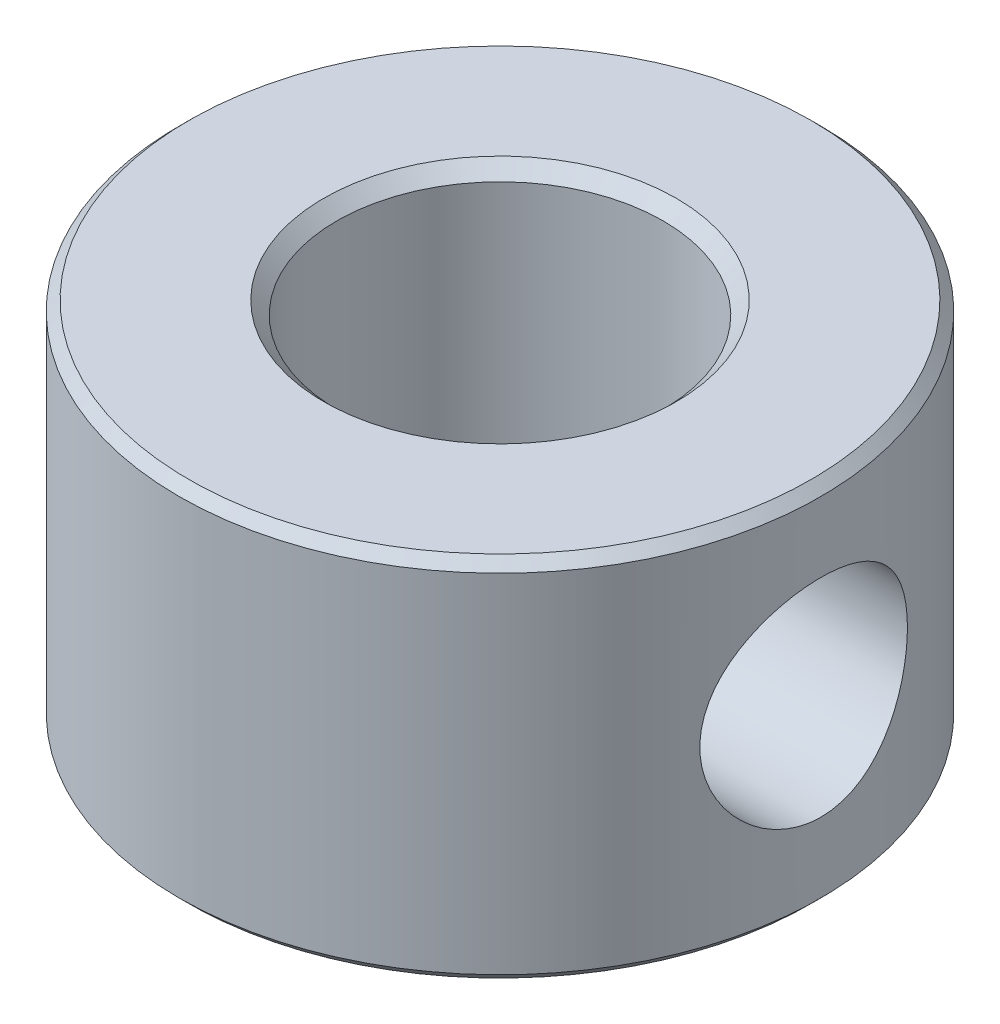
ISO-10303-21;
HEADER;
FILE_DESCRIPTION(('STEP AP214'),'2;1');
FILE_NAME('part.step','',(''),(''),'','','');
FILE_SCHEMA(('AUTOMOTIVE_DESIGN { 1 0 10303 214 1 1 1 1 }'));
ENDSEC;
DATA;
#1=APPLICATION_CONTEXT('core data for automotive mechanical design processes');
#2=APPLICATION_PROTOCOL_DEFINITION('international standard','automotive_design',2000,#1);
#3=PRODUCT_CONTEXT('',#1,'mechanical');
#4=PRODUCT('Part','Part','',(#3));
#5=PRODUCT_RELATED_PRODUCT_CATEGORY('part','',(#4));
#6=PRODUCT_DEFINITION_FORMATION('','',#4);
#7=PRODUCT_DEFINITION_CONTEXT('part definition',#1,'design');
#8=PRODUCT_DEFINITION('design','',#6,#7);
#9=PRODUCT_DEFINITION_SHAPE('','',#8);
#10=(LENGTH_UNIT() NAMED_UNIT(*) SI_UNIT(.MILLI.,.METRE.));
#11=(NAMED_UNIT(*) PLANE_ANGLE_UNIT() SI_UNIT($,.RADIAN.));
#12=(NAMED_UNIT(*) SI_UNIT($,.STERADIAN.) SOLID_ANGLE_UNIT());
#13=UNCERTAINTY_MEASURE_WITH_UNIT(LENGTH_MEASURE(1.E-05),#10,'distance_accuracy_value','');
#14=(GEOMETRIC_REPRESENTATION_CONTEXT(3) GLOBAL_UNCERTAINTY_ASSIGNED_CONTEXT((#13)) GLOBAL_UNIT_ASSIGNED_CONTEXT((#10,
#11,#12)) REPRESENTATION_CONTEXT('',''));
#15=CARTESIAN_POINT('',(0.,0.,0.));
#16=DIRECTION('',(0.,0.,1.));
#17=DIRECTION('',(1.,0.,0.));
#18=AXIS2_PLACEMENT_3D('',#15,#16,#17);
#19=CARTESIAN_POINT('',(0.,7.14502,0.));
#20=DIRECTION('',(0.,1.,0.));
#21=DIRECTION('',(0.,0.,-1.));
#22=AXIS2_PLACEMENT_3D('',#19,#20,#21);
#23=PLANE('',#22);
#24=CARTESIAN_POINT('',(0.,7.14502,0.));
#25=DIRECTION('',(0.,-1.,0.));
#26=DIRECTION('',(0.,0.,-1.));
#27=AXIS2_PLACEMENT_3D('',#24,#25,#26);
#28=CIRCLE('',#27,3.429);
#29=CARTESIAN_POINT('',(0.,7.14502,-3.429));
#30=VERTEX_POINT('',#29);
#31=EDGE_CURVE('E53',#30,#30,#28,.F.);
#32=ORIENTED_EDGE('',*,*,#31,.F.);
#33=EDGE_LOOP('',(#32));
#34=FACE_BOUND('',#33,.T.);
#35=CARTESIAN_POINT('',(0.,7.14502,0.));
#36=DIRECTION('',(0.,-1.,0.));
#37=DIRECTION('',(0.,0.,-1.));
#38=AXIS2_PLACEMENT_3D('',#35,#36,#37);
#39=CIRCLE('',#38,6.05155000000001);
#40=CARTESIAN_POINT('',(0.,7.14502,-6.05155000000001));
#41=VERTEX_POINT('',#40);
#42=EDGE_CURVE('E65',#41,#41,#39,.T.);
#43=ORIENTED_EDGE('',*,*,#42,.F.);
#44=EDGE_LOOP('',(#43));
#45=FACE_BOUND('',#44,.T.);
#46=ADVANCED_FACE('F37',(#34,#45),#23,.T.);
#47=CARTESIAN_POINT('',(0.,0.,0.));
#48=DIRECTION('',(0.,1.,0.));
#49=DIRECTION('',(0.,0.,-1.));
#50=AXIS2_PLACEMENT_3D('',#47,#48,#49);
#51=PLANE('',#50);
#52=CARTESIAN_POINT('',(0.,0.,0.));
#53=DIRECTION('',(0.,-1.,0.));
#54=DIRECTION('',(0.,0.,-1.));
#55=AXIS2_PLACEMENT_3D('',#52,#53,#54);
#56=CIRCLE('',#55,3.42899999999999);
#57=CARTESIAN_POINT('',(0.,0.,-3.42899999999999));
#58=VERTEX_POINT('',#57);
#59=EDGE_CURVE('E49',#58,#58,#56,.T.);
#60=ORIENTED_EDGE('',*,*,#59,.F.);
#61=EDGE_LOOP('',(#60));
#62=FACE_BOUND('',#61,.T.);
#63=CARTESIAN_POINT('',(0.,0.,0.));
#64=DIRECTION('',(0.,-1.,0.));
#65=DIRECTION('',(0.,0.,-1.));
#66=AXIS2_PLACEMENT_3D('',#63,#64,#65);
#67=CIRCLE('',#66,6.05154999999999);
#68=CARTESIAN_POINT('',(0.,0.,-6.05154999999999));
#69=VERTEX_POINT('',#68);
#70=EDGE_CURVE('E68',#69,#69,#67,.F.);
#71=ORIENTED_EDGE('',*,*,#70,.F.);
#72=EDGE_LOOP('',(#71));
#73=FACE_BOUND('',#72,.T.);
#74=ADVANCED_FACE('F94',(#62,#73),#51,.F.);
#75=CARTESIAN_POINT('',(0.,7.14502,0.));
#76=DIRECTION('',(0.,-1.,0.));
#77=DIRECTION('',(0.,0.,1.));
#78=AXIS2_PLACEMENT_3D('',#75,#76,#77);
#79=CYLINDRICAL_SURFACE('',#78,6.24205);
#80=CARTESIAN_POINT('',(6.24205,1.55321000000001,0.));
#81=CARTESIAN_POINT('',(6.24204987098175,1.55321010305949,-0.110361607787844));
#82=CARTESIAN_POINT('',(6.2390958556555,1.56228707806343,-0.220725250071233));
#83=CARTESIAN_POINT('',(6.22760191806045,1.59825170997894,-0.43821286009597));
#84=CARTESIAN_POINT('',(6.21906109093358,1.62514225204233,-0.545336300102706));
#85=CARTESIAN_POINT('',(6.19732396104721,1.69572360172864,-0.753176327739559));
#86=CARTESIAN_POINT('',(6.18413516935356,1.73938731425837,-0.853902944457347));
#87=CARTESIAN_POINT('',(6.15445572442031,1.84215651905202,-1.04660424357037));
#88=CARTESIAN_POINT('',(6.13796448104393,1.90126477177849,-1.13857735740495));
#89=CARTESIAN_POINT('',(6.10281698787693,2.03528655688525,-1.31418213372415));
#90=CARTESIAN_POINT('',(6.08411109688674,2.11061619914058,-1.39748623675391));
#91=CARTESIAN_POINT('',(6.04692251587769,2.27405714507101,-1.55052602599469));
#92=CARTESIAN_POINT('',(6.02843987198791,2.36217104299494,-1.62025895152977));
#93=CARTESIAN_POINT('',(5.99325079912104,2.55157379256864,-1.74600156347859));
#94=CARTESIAN_POINT('',(5.97660524073269,2.65315242483614,-1.80159342593578));
#95=CARTESIAN_POINT('',(5.94772589089101,2.86484265778281,-1.89476693037713));
#96=CARTESIAN_POINT('',(5.93549084231211,2.97495181612178,-1.93235370534908));
#97=CARTESIAN_POINT('',(5.91733885565084,3.1968659604572,-1.98723572400281));
#98=CARTESIAN_POINT('',(5.91123225336117,3.30850390708536,-2.00514185100346));
#99=CARTESIAN_POINT('',(5.90546653592937,3.53335370137909,-2.02206344905887));
#100=CARTESIAN_POINT('',(5.90580556391969,3.64656508637492,-2.02108436059574));
#101=CARTESIAN_POINT('',(5.91272601191444,3.86621428099793,-2.00073929260716));
#102=CARTESIAN_POINT('',(5.91904017316428,3.9727348633256,-1.98216048494432));
#103=CARTESIAN_POINT('',(5.9367636319365,4.18105715713211,-1.92842373887578));
#104=CARTESIAN_POINT('',(5.94817350644599,4.28285833279176,-1.89326392297893));
#105=CARTESIAN_POINT('',(5.9750000638336,4.48068193047347,-1.80682863570085));
#106=CARTESIAN_POINT('',(5.99047575426177,4.57659119538614,-1.75531328608411));
#107=CARTESIAN_POINT('',(6.02366439491423,4.75865725871121,-1.63779580184213));
#108=CARTESIAN_POINT('',(6.04137796011666,4.8448113639737,-1.57178968139509));
#109=CARTESIAN_POINT('',(6.07810787944163,5.00935790224419,-1.42334436695478));
#110=CARTESIAN_POINT('',(6.09714554601541,5.087163384294,-1.34025857265405));
#111=CARTESIAN_POINT('',(6.13361656052184,5.22788482665606,-1.16198264310722));
#112=CARTESIAN_POINT('',(6.15104977188977,5.29079952023982,-1.06679147914057));
#113=CARTESIAN_POINT('',(6.1825538765581,5.40038974788208,-0.86581670750765));
#114=CARTESIAN_POINT('',(6.19659358003453,5.44691631679446,-0.759946647618174));
#115=CARTESIAN_POINT('',(6.21950303570453,5.52132121703144,-0.54132106343912));
#116=CARTESIAN_POINT('',(6.22837447493545,5.54920563401166,-0.428567799274002));
#117=CARTESIAN_POINT('',(6.23967218609234,5.58451406338999,-0.204351750125743));
#118=CARTESIAN_POINT('',(6.24234836669601,5.59273188950391,-0.0930263876335407));
#119=CARTESIAN_POINT('',(6.24169855806503,5.59072404152825,0.129429578308453));
#120=CARTESIAN_POINT('',(6.23837351593071,5.58050127769389,0.24056020971978));
#121=CARTESIAN_POINT('',(6.2262595122325,5.54253510603896,0.456350285277136));
#122=CARTESIAN_POINT('',(6.21762037114401,5.51527179391414,0.561103426418709));
#123=CARTESIAN_POINT('',(6.19590024482501,5.44459174553279,0.76451293236808));
#124=CARTESIAN_POINT('',(6.18281870057258,5.40117297624445,0.863168528026936));
#125=CARTESIAN_POINT('',(6.15313628841962,5.29818576054547,1.05437511503154));
#126=CARTESIAN_POINT('',(6.13645440765245,5.23823482283847,1.14670716032191));
#127=CARTESIAN_POINT('',(6.10147076745199,5.10433888852933,1.3202626868448));
#128=CARTESIAN_POINT('',(6.08316854016024,5.03038984305611,1.40148294231827));
#129=CARTESIAN_POINT('',(6.04602084377535,4.86686240241354,1.5541099164561));
#130=CARTESIAN_POINT('',(6.02718549622144,4.77675194292228,1.62495036869059));
#131=CARTESIAN_POINT('',(5.99190961061176,4.5855150744732,1.75056523990495));
#132=CARTESIAN_POINT('',(5.97546906232882,4.48438871256282,1.80533972749672));
#133=CARTESIAN_POINT('',(5.94701677031808,4.27407660655124,1.89696824379646));
#134=CARTESIAN_POINT('',(5.93499183150095,4.16491606411411,1.93387577102216));
#135=CARTESIAN_POINT('',(5.91687128549093,3.94145533762214,1.9886353446116));
#136=CARTESIAN_POINT('',(5.91077320968064,3.82715731416885,2.00649532483426));
#137=CARTESIAN_POINT('',(5.90546645058777,3.60262049145591,2.02205698074767));
#138=CARTESIAN_POINT('',(5.90593835750382,3.49245325204258,2.02069320679469));
#139=CARTESIAN_POINT('',(5.9129352562404,3.27400282004023,2.00012503239849));
#140=CARTESIAN_POINT('',(5.91945992647479,3.1657195276676,1.98092157978566));
#141=CARTESIAN_POINT('',(5.93759622909786,2.95591379377526,1.92586390591926));
#142=CARTESIAN_POINT('',(5.94912038733202,2.85430823093395,1.89029539712448));
#143=CARTESIAN_POINT('',(5.97592952606043,2.65842730062317,1.80374539537514));
#144=CARTESIAN_POINT('',(5.99121530918817,2.56415350322009,1.75276061245461));
#145=CARTESIAN_POINT('',(6.02461663149163,2.38137369030562,1.63435334289241));
#146=CARTESIAN_POINT('',(6.04282328770591,2.29326947134838,1.56633643673177));
#147=CARTESIAN_POINT('',(6.07961581104668,2.12942305747808,1.41682013012052));
#148=CARTESIAN_POINT('',(6.0982017813197,2.05368427686617,1.33531701837245));
#149=CARTESIAN_POINT('',(6.13445933896264,1.9139875328968,1.15762581730249));
#150=CARTESIAN_POINT('',(6.15207416705775,1.85054995408412,1.06101566124169));
#151=CARTESIAN_POINT('',(6.18366159886644,1.74089240857486,0.85793612079198));
#152=CARTESIAN_POINT('',(6.19763537745447,1.69466688591308,0.751469931761009));
#153=CARTESIAN_POINT('',(6.21962033037372,1.62337240261327,0.538709548099766));
#154=CARTESIAN_POINT('',(6.22795509697885,1.59714160143855,0.43283792917931));
#155=CARTESIAN_POINT('',(6.23916934417463,1.56206242459734,0.217977701178107));
#156=CARTESIAN_POINT('',(6.24205012741459,1.55320989822154,0.108989842705757));
#157=CARTESIAN_POINT('',(6.24205,1.55321000000001,0.));
#158=B_SPLINE_CURVE_WITH_KNOTS('',3,(#80,#81,#82,#83,#84,#85,#86,#87,#88,#89,#90,#91,#92,#93,
#94,#95,#96,#97,#98,#99,#100,#101,#102,#103,#104,#105,#106,#107,#108,#109,#110,#111,#112,#113,
#114,#115,#116,#117,#118,#119,#120,#121,#122,#123,#124,#125,#126,#127,#128,#129,#130,#131,#132,
#133,#134,#135,#136,#137,#138,#139,#140,#141,#142,#143,#144,#145,#146,#147,#148,#149,#150,#151,
#152,#153,#154,#155,#156,#157),.UNSPECIFIED.,.T.,.F.,(4,2,2,2,2,2,2,2,2,2,2,2,2,2,2,2,2,2,2,2,2,
2,2,2,2,2,2,2,2,2,2,2,2,2,2,2,2,2,4),(0.,0.330683969748947,0.661421511406924,0.991627016821767,
1.32189158156642,1.66193363828124,2.0020447948915,2.35127007678386,2.70039574030425,
3.03834853982958,3.37620398284384,3.69962812460597,4.02308889694029,4.35153173210665,
4.68006502198354,5.02469184077873,5.36934796573399,5.71706067156383,6.06465981247974,
6.39797274878697,6.73123308694764,7.05550303184148,7.37981379725744,7.71236907007649,
8.04502067995674,8.39185943616832,8.7386967111361,9.08448893725422,9.43013707450293,
9.75904221588357,10.0879298833811,10.4112815982195,10.7347023678671,11.0715467782565,
11.4084840402093,11.7575142248891,12.1064316465071,12.4330833320422,12.7596569890474),.UNSPECIFIED.);
#159=CARTESIAN_POINT('',(6.24205,1.55321000000001,0.));
#160=VERTEX_POINT('',#159);
#161=EDGE_CURVE('E10',#160,#160,#158,.T.);
#162=ORIENTED_EDGE('',*,*,#161,.F.);
#163=EDGE_LOOP('',(#162));
#164=FACE_BOUND('',#163,.T.);
#165=CARTESIAN_POINT('',(0.,0.190500000000006,0.));
#166=DIRECTION('',(0.,-1.,0.));
#167=DIRECTION('',(0.,0.,-1.));
#168=AXIS2_PLACEMENT_3D('',#165,#166,#167);
#169=CIRCLE('',#168,6.24205);
#170=CARTESIAN_POINT('',(0.,0.190500000000006,-6.24205));
#171=VERTEX_POINT('',#170);
#172=EDGE_CURVE('E71',#171,#171,#169,.T.);
#173=ORIENTED_EDGE('',*,*,#172,.F.);
#174=EDGE_LOOP('',(#173));
#175=FACE_BOUND('',#174,.T.);
#176=CARTESIAN_POINT('',(0.,6.95452000000001,0.));
#177=DIRECTION('',(0.,-1.,0.));
#178=DIRECTION('',(0.,0.,-1.));
#179=AXIS2_PLACEMENT_3D('',#176,#177,#178);
#180=CIRCLE('',#179,6.24205);
#181=CARTESIAN_POINT('',(0.,6.95452000000001,-6.24205));
#182=VERTEX_POINT('',#181);
#183=EDGE_CURVE('E74',#182,#182,#180,.F.);
#184=ORIENTED_EDGE('',*,*,#183,.F.);
#185=EDGE_LOOP('',(#184));
#186=FACE_BOUND('',#185,.T.);
#187=ADVANCED_FACE('F90',(#164,#175,#186),#79,.T.);
#188=CARTESIAN_POINT('',(0.,7.14502,0.));
#189=DIRECTION('',(0.,-1.,0.));
#190=DIRECTION('',(0.,0.,1.));
#191=AXIS2_PLACEMENT_3D('',#188,#189,#190);
#192=CYLINDRICAL_SURFACE('',#191,3.175);
#193=CARTESIAN_POINT('',(2.45011275454825,3.57251000000001,-2.0193));
#194=CARTESIAN_POINT('',(2.45012817951552,3.67245127069754,-2.01929051569736));
#195=CARTESIAN_POINT('',(2.45634010720797,3.77248232992501,-2.0118162399891));
#196=CARTESIAN_POINT('',(2.48006385016957,3.96908968147833,-1.98248167673376));
#197=CARTESIAN_POINT('',(2.49759801227128,4.06565874208905,-1.96059293748518));
#198=CARTESIAN_POINT('',(2.54096978697851,4.25194627589823,-1.9040331603516));
#199=CARTESIAN_POINT('',(2.56673468951973,4.34171652404969,-1.86947367457507));
#200=CARTESIAN_POINT('',(2.62353964875392,4.51407455142343,-1.78888009345359));
#201=CARTESIAN_POINT('',(2.6545807662544,4.5966608812278,-1.74284368975069));
#202=CARTESIAN_POINT('',(2.72365220953031,4.76495151025591,-1.63312725242593));
#203=CARTESIAN_POINT('',(2.76205343085876,4.84948324500192,-1.56788172310624));
#204=CARTESIAN_POINT('',(2.83851915466699,5.0074001775689,-1.42479045231801));
#205=CARTESIAN_POINT('',(2.87658333731988,5.08077567508321,-1.34693386567764));
#206=CARTESIAN_POINT('',(2.95378200389087,5.22351661538209,-1.16891001207364));
#207=CARTESIAN_POINT('',(2.99244190742994,5.29119834305825,-1.06716606271611));
#208=CARTESIAN_POINT('',(3.06097746101505,5.40792857889046,-0.850805271225741));
#209=CARTESIAN_POINT('',(3.09086204386166,5.45699605031168,-0.736201684957571));
#210=CARTESIAN_POINT('',(3.13566626418313,5.52956734525047,-0.50999490435427));
#211=CARTESIAN_POINT('',(3.15182273437589,5.55520558748186,-0.399328091275864));
#212=CARTESIAN_POINT('',(3.17222196724828,5.58748014691784,-0.174221138396404));
#213=CARTESIAN_POINT('',(3.17647787280316,5.59413742668433,-0.0597853025568782));
#214=CARTESIAN_POINT('',(3.17286513938984,5.58844994541019,0.152424127581291));
#215=CARTESIAN_POINT('',(3.16659762255069,5.57861476842587,0.250305470554215));
#216=CARTESIAN_POINT('',(3.14547384128328,5.54510302412573,0.442698018208736));
#217=CARTESIAN_POINT('',(3.13061693122206,5.52142541632403,0.537208968983375));
#218=CARTESIAN_POINT('',(3.09356053401838,5.46132504253611,0.720612526879305));
#219=CARTESIAN_POINT('',(3.07135380901376,5.42488971109532,0.809499492488899));
#220=CARTESIAN_POINT('',(3.02129545312328,5.3406502778234,0.979948739206574));
#221=CARTESIAN_POINT('',(2.99344261064515,5.29284373547797,1.06150944275226));
#222=CARTESIAN_POINT('',(2.93020696894433,5.1804560908818,1.22606234754406));
#223=CARTESIAN_POINT('',(2.89431735966664,5.11451822513684,1.307931323684));
#224=CARTESIAN_POINT('',(2.82059026986525,4.97124303530304,1.46016022959231));
#225=CARTESIAN_POINT('',(2.78274994751954,4.89388875571949,1.53050270668809));
#226=CARTESIAN_POINT('',(2.70316998021409,4.71754891610958,1.66750948099941));
#227=CARTESIAN_POINT('',(2.66160715287759,4.61705168042349,1.73234677283066));
#228=CARTESIAN_POINT('',(2.58550168350825,4.40411899617822,1.84401294040444));
#229=CARTESIAN_POINT('',(2.55094631600009,4.29170576286593,1.89087460028104));
#230=CARTESIAN_POINT('',(2.50255370083124,4.08887060127734,1.95422417089593));
#231=CARTESIAN_POINT('',(2.48564302359113,4.00068038933684,1.97549340596572));
#232=CARTESIAN_POINT('',(2.46108567735713,3.82103371563983,2.00601072185795));
#233=CARTESIAN_POINT('',(2.45342548274737,3.72958222444307,2.01527635522343));
#234=CARTESIAN_POINT('',(2.44853180042155,3.54572667144574,2.02122148552108));
#235=CARTESIAN_POINT('',(2.45132711866525,3.45332067847948,2.01786621047329));
#236=CARTESIAN_POINT('',(2.46695474139764,3.27064534005662,1.99872482253261));
#237=CARTESIAN_POINT('',(2.47979543499971,3.18037784545299,1.9829283196228));
#238=CARTESIAN_POINT('',(2.51323380479194,3.00644908196719,1.94035603763407));
#239=CARTESIAN_POINT('',(2.53363649039046,2.92268087309288,1.9138548599113));
#240=CARTESIAN_POINT('',(2.57995729521188,2.76061707475904,1.8509371143313));
#241=CARTESIAN_POINT('',(2.60587725559257,2.68232332378447,1.81451723538921));
#242=CARTESIAN_POINT('',(2.66637185156354,2.51729481532054,1.72468862869318));
#243=CARTESIAN_POINT('',(2.70165014338981,2.43186645675553,1.66935511652756));
#244=CARTESIAN_POINT('',(2.77361921697772,2.27053926072513,1.54684224267733));
#245=CARTESIAN_POINT('',(2.81031162521157,2.19465185189079,1.47964890187628));
#246=CARTESIAN_POINT('',(2.88849831537442,2.04101442417589,1.32146957597982));
#247=CARTESIAN_POINT('',(2.92970866402265,1.96526420866532,1.22837765550165));
#248=CARTESIAN_POINT('',(3.0057169760996,1.83056670958564,1.02843925094223));
#249=CARTESIAN_POINT('',(3.04052210010589,1.77160062174494,0.921608355915268));
#250=CARTESIAN_POINT('',(3.09386715213231,1.68308226245439,0.719216299701137));
#251=CARTESIAN_POINT('',(3.11426889307068,1.65000343239507,0.625687670231277));
#252=CARTESIAN_POINT('',(3.14677961976787,1.59777158788784,0.433449506453149));
#253=CARTESIAN_POINT('',(3.15889519725594,1.57860750336512,0.334744157744077));
#254=CARTESIAN_POINT('',(3.17373957805951,1.5551716455388,0.134549858045074));
#255=CARTESIAN_POINT('',(3.1764391602035,1.5509462316746,0.0330532251289087));
#256=CARTESIAN_POINT('',(3.17210070452945,1.55776996732009,-0.169220717606883));
#257=CARTESIAN_POINT('',(3.16506174909833,1.56882055621006,-0.269997958742477));
#258=CARTESIAN_POINT('',(3.14250337260816,1.60465457582786,-0.462903169338655));
#259=CARTESIAN_POINT('',(3.12741313735222,1.62874382787445,-0.555213410179458));
#260=CARTESIAN_POINT('',(3.09028356911829,1.68906540013466,-0.734262324128188));
#261=CARTESIAN_POINT('',(3.06824310438062,1.72529969808064,-0.821000087055458));
#262=CARTESIAN_POINT('',(3.01687781461152,1.81188247564594,-0.993896475754064));
#263=CARTESIAN_POINT('',(2.98711895257937,1.86311130435253,-1.07948239570686));
#264=CARTESIAN_POINT('',(2.92359589755363,1.9767097608168,-1.24128256073288));
#265=CARTESIAN_POINT('',(2.88982844010591,2.03908848984223,-1.31748906326209));
#266=CARTESIAN_POINT('',(2.81541804007874,2.18399577966154,-1.47048578378875));
#267=CARTESIAN_POINT('',(2.77450861601171,2.26814535064112,-1.54561455035015));
#268=CARTESIAN_POINT('',(2.69448679509777,2.44835642528027,-1.681239830294));
#269=CARTESIAN_POINT('',(2.65537483579392,2.54442080844168,-1.7417327961185));
#270=CARTESIAN_POINT('',(2.58891897326561,2.73228299516957,-1.83876550837132));
#271=CARTESIAN_POINT('',(2.56069019061929,2.82261791563855,-1.87752281278317));
#272=CARTESIAN_POINT('',(2.51228784962043,3.00981054967502,-1.94182185539048));
#273=CARTESIAN_POINT('',(2.49209287945083,3.10665010978251,-1.96739877665449));
#274=CARTESIAN_POINT('',(2.46853356270056,3.26567120028778,-1.99678820017446));
#275=CARTESIAN_POINT('',(2.4616738393758,3.32651506264098,-2.00520384926547));
#276=CARTESIAN_POINT('',(2.45245846542436,3.44906447596038,-2.01646293280568));
#277=CARTESIAN_POINT('',(2.45010322559336,3.51077010500032,-2.01930585903946));
#278=CARTESIAN_POINT('',(2.45011275454825,3.57251000000001,-2.0193));
#279=B_SPLINE_CURVE_WITH_KNOTS('',3,(#193,#194,#195,#196,#197,#198,#199,#200,#201,#202,#203,
#204,#205,#206,#207,#208,#209,#210,#211,#212,#213,#214,#215,#216,#217,#218,#219,#220,#221,#222,
#223,#224,#225,#226,#227,#228,#229,#230,#231,#232,#233,#234,#235,#236,#237,#238,#239,#240,#241,
#242,#243,#244,#245,#246,#247,#248,#249,#250,#251,#252,#253,#254,#255,#256,#257,#258,#259,#260,
#261,#262,#263,#264,#265,#266,#267,#268,#269,#270,#271,#272,#273,#274,#275,#276,#277,#278),
.UNSPECIFIED.,.T.,.F.,(4,2,2,2,2,2,2,2,2,2,2,2,2,2,2,2,2,2,2,2,2,2,2,2,2,2,2,2,2,2,2,2,2,2,2,2,
2,2,2,2,2,2,4),(0.,0.299545346163704,0.599683723262751,0.897240786031996,1.19485774494705,
1.53399780499747,1.87343108015559,2.25583678812835,2.63785186753818,2.9799751474998,
3.32172044011375,3.61602438944013,3.91035046338392,4.20496724691206,4.49964731888726,
4.83159144770302,5.16403363102358,5.54206146658147,5.91939653552262,6.19510071677628,
6.4704012864861,6.74646089414035,7.02275129165826,7.29236365357904,7.56206612870598,
7.8840575585005,8.20643108372259,8.58524226804171,8.96362736164553,9.2661764004181,
9.56848447745555,9.87172989295247,10.175003883675,10.4635252097641,10.7520935422966,
11.0631665349709,11.3744946147801,11.7329995987663,12.0915913935742,12.3972580961101,
12.7021045844747,12.887135370411,13.0721830298085),.UNSPECIFIED.);
#280=CARTESIAN_POINT('',(2.45011275454825,3.57251000000001,-2.0193));
#281=VERTEX_POINT('',#280);
#282=EDGE_CURVE('E77',#281,#281,#279,.T.);
#283=ORIENTED_EDGE('',*,*,#282,.T.);
#284=EDGE_LOOP('',(#283));
#285=FACE_BOUND('',#284,.T.);
#286=CARTESIAN_POINT('',(0.,6.89102,0.));
#287=DIRECTION('',(0.,-1.,0.));
#288=DIRECTION('',(0.,0.,-1.));
#289=AXIS2_PLACEMENT_3D('',#286,#287,#288);
#290=CIRCLE('',#289,3.175);
#291=CARTESIAN_POINT('',(0.,6.89102,-3.175));
#292=VERTEX_POINT('',#291);
#293=EDGE_CURVE('E57',#292,#292,#290,.T.);
#294=ORIENTED_EDGE('',*,*,#293,.F.);
#295=EDGE_LOOP('',(#294));
#296=FACE_BOUND('',#295,.T.);
#297=CARTESIAN_POINT('',(0.,0.253999999999994,0.));
#298=DIRECTION('',(0.,-1.,0.));
#299=DIRECTION('',(0.,0.,-1.));
#300=AXIS2_PLACEMENT_3D('',#297,#298,#299);
#301=CIRCLE('',#300,3.175);
#302=CARTESIAN_POINT('',(0.,0.253999999999994,-3.175));
#303=VERTEX_POINT('',#302);
#304=EDGE_CURVE('E62',#303,#303,#301,.F.);
#305=ORIENTED_EDGE('',*,*,#304,.F.);
#306=EDGE_LOOP('',(#305));
#307=FACE_BOUND('',#306,.T.);
#308=ADVANCED_FACE('F85',(#285,#296,#307),#192,.F.);
#309=CARTESIAN_POINT('',(0.,0.190500000000006,0.));
#310=DIRECTION('',(0.,1.,0.));
#311=DIRECTION('',(0.,0.,-1.));
#312=AXIS2_PLACEMENT_3D('',#309,#310,#311);
#313=CONICAL_SURFACE('',#312,6.24205,0.785398163397453);
#314=ORIENTED_EDGE('',*,*,#70,.T.);
#315=EDGE_LOOP('',(#314));
#316=FACE_BOUND('',#315,.T.);
#317=ORIENTED_EDGE('',*,*,#172,.T.);
#318=EDGE_LOOP('',(#317));
#319=FACE_BOUND('',#318,.T.);
#320=ADVANCED_FACE('F89',(#316,#319),#313,.T.);
#321=CARTESIAN_POINT('',(0.,7.14502,0.));
#322=DIRECTION('',(0.,-1.,0.));
#323=DIRECTION('',(0.,0.,1.));
#324=AXIS2_PLACEMENT_3D('',#321,#322,#323);
#325=CONICAL_SURFACE('',#324,6.05155000000001,0.785398163397455);
#326=ORIENTED_EDGE('',*,*,#183,.T.);
#327=EDGE_LOOP('',(#326));
#328=FACE_BOUND('',#327,.T.);
#329=ORIENTED_EDGE('',*,*,#42,.T.);
#330=EDGE_LOOP('',(#329));
#331=FACE_BOUND('',#330,.T.);
#332=ADVANCED_FACE('F104',(#328,#331),#325,.T.);
#333=CARTESIAN_POINT('',(0.,6.89102,0.));
#334=DIRECTION('',(0.,1.,0.));
#335=DIRECTION('',(0.,0.,-1.));
#336=AXIS2_PLACEMENT_3D('',#333,#334,#335);
#337=CONICAL_SURFACE('',#336,3.175,0.785398163397447);
#338=ORIENTED_EDGE('',*,*,#31,.T.);
#339=EDGE_LOOP('',(#338));
#340=FACE_BOUND('',#339,.T.);
#341=ORIENTED_EDGE('',*,*,#293,.T.);
#342=EDGE_LOOP('',(#341));
#343=FACE_BOUND('',#342,.T.);
#344=ADVANCED_FACE('F107',(#340,#343),#337,.F.);
#345=CARTESIAN_POINT('',(0.,0.,0.));
#346=DIRECTION('',(0.,-1.,0.));
#347=DIRECTION('',(0.,0.,1.));
#348=AXIS2_PLACEMENT_3D('',#345,#346,#347);
#349=CONICAL_SURFACE('',#348,3.42899999999999,0.785398163397446);
#350=ORIENTED_EDGE('',*,*,#304,.T.);
#351=EDGE_LOOP('',(#350));
#352=FACE_BOUND('',#351,.T.);
#353=ORIENTED_EDGE('',*,*,#59,.T.);
#354=EDGE_LOOP('',(#353));
#355=FACE_BOUND('',#354,.T.);
#356=ADVANCED_FACE('F39',(#352,#355),#349,.F.);
#357=CARTESIAN_POINT('',(0.,3.57251000000001,0.));
#358=DIRECTION('',(-1.,0.,0.));
#359=DIRECTION('',(0.,0.,-1.));
#360=AXIS2_PLACEMENT_3D('',#357,#358,#359);
#361=CYLINDRICAL_SURFACE('',#360,2.0193);
#362=ORIENTED_EDGE('',*,*,#282,.F.);
#363=EDGE_LOOP('',(#362));
#364=FACE_BOUND('',#363,.T.);
#365=ORIENTED_EDGE('',*,*,#161,.T.);
#366=EDGE_LOOP('',(#365));
#367=FACE_BOUND('',#366,.T.);
#368=ADVANCED_FACE('F83',(#364,#367),#361,.F.);
#369=CLOSED_SHELL('',(#46,#74,#187,#308,#320,#332,#344,#356,#368));
#370=MANIFOLD_SOLID_BREP('B2',#369);
#371=ADVANCED_BREP_SHAPE_REPRESENTATION('',(#18,#370),#14);
#372=SHAPE_DEFINITION_REPRESENTATION(#9,#371);
ENDSEC;
END-ISO-10303-21;
